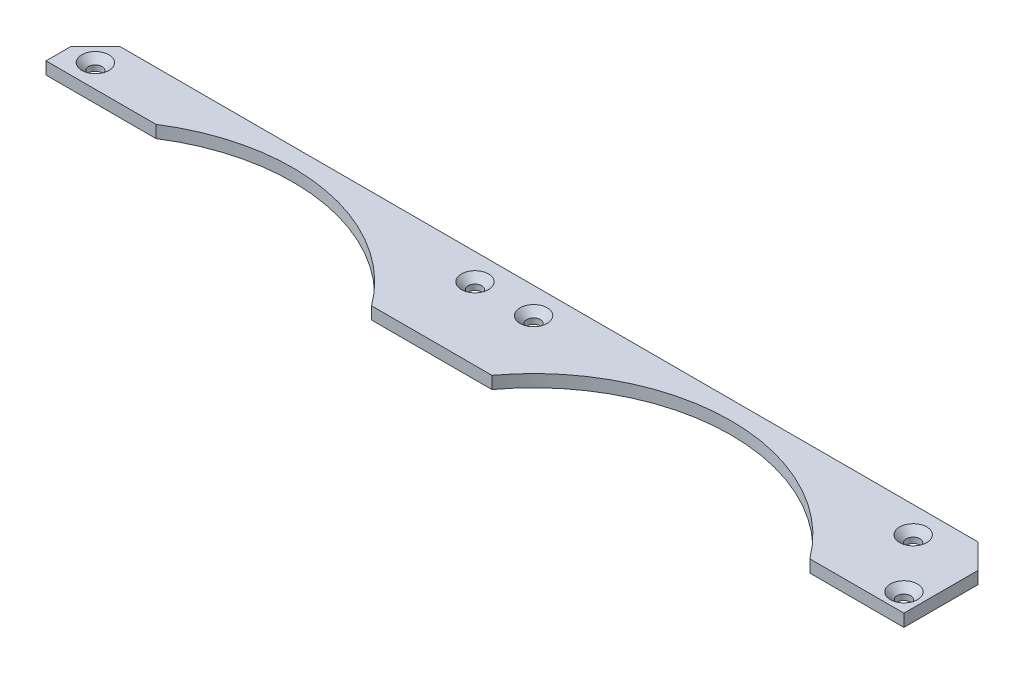
ISO-10303-21;
HEADER;
FILE_DESCRIPTION(('STEP AP214'),'2;1');
FILE_NAME('part.step','',(''),(''),'','','');
FILE_SCHEMA(('AUTOMOTIVE_DESIGN { 1 0 10303 214 1 1 1 1 }'));
ENDSEC;
DATA;
#1=APPLICATION_CONTEXT('core data for automotive mechanical design processes');
#2=APPLICATION_PROTOCOL_DEFINITION('international standard','automotive_design',2000,#1);
#3=PRODUCT_CONTEXT('',#1,'mechanical');
#4=PRODUCT('Part','Part','',(#3));
#5=PRODUCT_RELATED_PRODUCT_CATEGORY('part','',(#4));
#6=PRODUCT_DEFINITION_FORMATION('','',#4);
#7=PRODUCT_DEFINITION_CONTEXT('part definition',#1,'design');
#8=PRODUCT_DEFINITION('design','',#6,#7);
#9=PRODUCT_DEFINITION_SHAPE('','',#8);
#10=(LENGTH_UNIT() NAMED_UNIT(*) SI_UNIT(.MILLI.,.METRE.));
#11=(NAMED_UNIT(*) PLANE_ANGLE_UNIT() SI_UNIT($,.RADIAN.));
#12=(NAMED_UNIT(*) SI_UNIT($,.STERADIAN.) SOLID_ANGLE_UNIT());
#13=UNCERTAINTY_MEASURE_WITH_UNIT(LENGTH_MEASURE(1.E-05),#10,'distance_accuracy_value','');
#14=(GEOMETRIC_REPRESENTATION_CONTEXT(3) GLOBAL_UNCERTAINTY_ASSIGNED_CONTEXT((#13)) GLOBAL_UNIT_ASSIGNED_CONTEXT((#10,
#11,#12)) REPRESENTATION_CONTEXT('',''));
#15=CARTESIAN_POINT('',(0.,0.,0.));
#16=DIRECTION('',(0.,0.,1.));
#17=DIRECTION('',(1.,0.,0.));
#18=AXIS2_PLACEMENT_3D('',#15,#16,#17);
#19=CARTESIAN_POINT('',(0.,2.,37.));
#20=DIRECTION('',(1.,0.,0.));
#21=DIRECTION('',(0.,0.,-1.));
#22=AXIS2_PLACEMENT_3D('',#19,#20,#21);
#23=PLANE('',#22);
#24=DIRECTION('',(0.,0.,1.));
#25=VECTOR('',#24,1.);
#26=CARTESIAN_POINT('',(0.,0.,37.));
#27=LINE('',#26,#25);
#28=CARTESIAN_POINT('',(0.,0.,4.));
#29=VERTEX_POINT('',#28);
#30=CARTESIAN_POINT('',(0.,0.,8.));
#31=VERTEX_POINT('',#30);
#32=EDGE_CURVE('E177',#29,#31,#27,.T.);
#33=ORIENTED_EDGE('',*,*,#32,.T.);
#34=DIRECTION('',(0.,1.,0.));
#35=VECTOR('',#34,1.);
#36=CARTESIAN_POINT('',(0.,2.,8.));
#37=LINE('',#36,#35);
#38=CARTESIAN_POINT('',(0.,2.,8.));
#39=VERTEX_POINT('',#38);
#40=EDGE_CURVE('E183',#31,#39,#37,.T.);
#41=ORIENTED_EDGE('',*,*,#40,.T.);
#42=DIRECTION('',(0.,0.,1.));
#43=VECTOR('',#42,1.);
#44=CARTESIAN_POINT('',(0.,2.,37.));
#45=LINE('',#44,#43);
#46=CARTESIAN_POINT('',(0.,2.,4.));
#47=VERTEX_POINT('',#46);
#48=EDGE_CURVE('E187',#47,#39,#45,.T.);
#49=ORIENTED_EDGE('',*,*,#48,.F.);
#50=DIRECTION('',(0.,-1.,0.));
#51=VECTOR('',#50,1.);
#52=CARTESIAN_POINT('',(0.,2.,4.));
#53=LINE('',#52,#51);
#54=EDGE_CURVE('E139',#47,#29,#53,.T.);
#55=ORIENTED_EDGE('',*,*,#54,.T.);
#56=EDGE_LOOP('',(#33,#41,#49,#55));
#57=FACE_BOUND('',#56,.T.);
#58=ADVANCED_FACE('F37',(#57),#23,.F.);
#59=CARTESIAN_POINT('',(147.,2.,37.));
#60=DIRECTION('',(-1.,0.,0.));
#61=DIRECTION('',(0.,0.,1.));
#62=AXIS2_PLACEMENT_3D('',#59,#60,#61);
#63=PLANE('',#62);
#64=DIRECTION('',(0.,0.,-1.));
#65=VECTOR('',#64,1.);
#66=CARTESIAN_POINT('',(147.,2.,37.));
#67=LINE('',#66,#65);
#68=CARTESIAN_POINT('',(147.,2.,16.));
#69=VERTEX_POINT('',#68);
#70=CARTESIAN_POINT('',(147.,2.,4.00000000000003));
#71=VERTEX_POINT('',#70);
#72=EDGE_CURVE('E142',#69,#71,#67,.T.);
#73=ORIENTED_EDGE('',*,*,#72,.F.);
#74=DIRECTION('',(0.,-1.,0.));
#75=VECTOR('',#74,1.);
#76=CARTESIAN_POINT('',(147.,2.,16.));
#77=LINE('',#76,#75);
#78=CARTESIAN_POINT('',(147.,0.,16.));
#79=VERTEX_POINT('',#78);
#80=EDGE_CURVE('E209',#69,#79,#77,.T.);
#81=ORIENTED_EDGE('',*,*,#80,.T.);
#82=DIRECTION('',(0.,0.,-1.));
#83=VECTOR('',#82,1.);
#84=CARTESIAN_POINT('',(147.,0.,37.));
#85=LINE('',#84,#83);
#86=CARTESIAN_POINT('',(147.,0.,4.00000000000003));
#87=VERTEX_POINT('',#86);
#88=EDGE_CURVE('E181',#79,#87,#85,.T.);
#89=ORIENTED_EDGE('',*,*,#88,.T.);
#90=DIRECTION('',(0.,1.,0.));
#91=VECTOR('',#90,1.);
#92=CARTESIAN_POINT('',(147.,2.,4.00000000000003));
#93=LINE('',#92,#91);
#94=EDGE_CURVE('E164',#87,#71,#93,.T.);
#95=ORIENTED_EDGE('',*,*,#94,.T.);
#96=EDGE_LOOP('',(#73,#81,#89,#95));
#97=FACE_BOUND('',#96,.T.);
#98=ADVANCED_FACE('F293',(#97),#63,.F.);
#99=CARTESIAN_POINT('',(0.,2.,0.));
#100=DIRECTION('',(0.,0.,1.));
#101=DIRECTION('',(1.,0.,0.));
#102=AXIS2_PLACEMENT_3D('',#99,#100,#101);
#103=PLANE('',#102);
#104=DIRECTION('',(-1.,0.,0.));
#105=VECTOR('',#104,1.);
#106=CARTESIAN_POINT('',(0.,0.,0.));
#107=LINE('',#106,#105);
#108=CARTESIAN_POINT('',(143.,0.,0.));
#109=VERTEX_POINT('',#108);
#110=CARTESIAN_POINT('',(4.,0.,0.));
#111=VERTEX_POINT('',#110);
#112=EDGE_CURVE('E145',#109,#111,#107,.T.);
#113=ORIENTED_EDGE('',*,*,#112,.T.);
#114=DIRECTION('',(0.,1.,0.));
#115=VECTOR('',#114,1.);
#116=CARTESIAN_POINT('',(4.,2.,0.));
#117=LINE('',#116,#115);
#118=CARTESIAN_POINT('',(4.,2.,0.));
#119=VERTEX_POINT('',#118);
#120=EDGE_CURVE('E158',#111,#119,#117,.T.);
#121=ORIENTED_EDGE('',*,*,#120,.T.);
#122=DIRECTION('',(-1.,0.,0.));
#123=VECTOR('',#122,1.);
#124=CARTESIAN_POINT('',(0.,2.,0.));
#125=LINE('',#124,#123);
#126=CARTESIAN_POINT('',(143.,2.,0.));
#127=VERTEX_POINT('',#126);
#128=EDGE_CURVE('E137',#127,#119,#125,.T.);
#129=ORIENTED_EDGE('',*,*,#128,.F.);
#130=DIRECTION('',(0.,-1.,0.));
#131=VECTOR('',#130,1.);
#132=CARTESIAN_POINT('',(143.,2.,0.));
#133=LINE('',#132,#131);
#134=EDGE_CURVE('E155',#127,#109,#133,.T.);
#135=ORIENTED_EDGE('',*,*,#134,.T.);
#136=EDGE_LOOP('',(#113,#121,#129,#135));
#137=FACE_BOUND('',#136,.T.);
#138=ADVANCED_FACE('F196',(#137),#103,.F.);
#139=CARTESIAN_POINT('',(0.,2.,0.));
#140=DIRECTION('',(0.,-1.,0.));
#141=DIRECTION('',(0.,0.,-1.));
#142=AXIS2_PLACEMENT_3D('',#139,#140,#141);
#143=PLANE('',#142);
#144=CARTESIAN_POINT('',(4.24999999999994,2.,4.25));
#145=DIRECTION('',(0.,1.,0.));
#146=DIRECTION('',(0.,0.,1.));
#147=AXIS2_PLACEMENT_3D('',#144,#145,#146);
#148=CIRCLE('',#147,2.2);
#149=CARTESIAN_POINT('',(4.24999999999994,2.,6.45));
#150=VERTEX_POINT('',#149);
#151=EDGE_CURVE('E258',#150,#150,#148,.T.);
#152=ORIENTED_EDGE('',*,*,#151,.F.);
#153=EDGE_LOOP('',(#152));
#154=FACE_BOUND('',#153,.T.);
#155=CARTESIAN_POINT('',(65.7499999999999,2.,4.25));
#156=DIRECTION('',(0.,1.,0.));
#157=DIRECTION('',(0.,0.,1.));
#158=AXIS2_PLACEMENT_3D('',#155,#156,#157);
#159=CIRCLE('',#158,2.20000000000001);
#160=CARTESIAN_POINT('',(65.7499999999999,2.,6.45000000000001));
#161=VERTEX_POINT('',#160);
#162=EDGE_CURVE('E249',#161,#161,#159,.T.);
#163=ORIENTED_EDGE('',*,*,#162,.F.);
#164=EDGE_LOOP('',(#163));
#165=FACE_BOUND('',#164,.T.);
#166=CARTESIAN_POINT('',(75.25,2.,4.25000000000001));
#167=DIRECTION('',(0.,1.,0.));
#168=DIRECTION('',(0.,0.,1.));
#169=AXIS2_PLACEMENT_3D('',#166,#167,#168);
#170=CIRCLE('',#169,2.20000000000001);
#171=CARTESIAN_POINT('',(75.25,2.,6.45000000000002));
#172=VERTEX_POINT('',#171);
#173=EDGE_CURVE('E240',#172,#172,#170,.T.);
#174=ORIENTED_EDGE('',*,*,#173,.F.);
#175=EDGE_LOOP('',(#174));
#176=FACE_BOUND('',#175,.T.);
#177=CARTESIAN_POINT('',(136.75,2.,4.25000000000001));
#178=DIRECTION('',(0.,1.,0.));
#179=DIRECTION('',(0.,0.,1.));
#180=AXIS2_PLACEMENT_3D('',#177,#178,#179);
#181=CIRCLE('',#180,2.20000000000001);
#182=CARTESIAN_POINT('',(136.75,2.,6.45000000000002));
#183=VERTEX_POINT('',#182);
#184=EDGE_CURVE('E231',#183,#183,#181,.T.);
#185=ORIENTED_EDGE('',*,*,#184,.F.);
#186=EDGE_LOOP('',(#185));
#187=FACE_BOUND('',#186,.T.);
#188=CARTESIAN_POINT('',(144.,2.,13.));
#189=DIRECTION('',(0.,1.,0.));
#190=DIRECTION('',(0.,0.,1.));
#191=AXIS2_PLACEMENT_3D('',#188,#189,#190);
#192=CIRCLE('',#191,2.20000000000001);
#193=CARTESIAN_POINT('',(144.,2.,15.2));
#194=VERTEX_POINT('',#193);
#195=EDGE_CURVE('E222',#194,#194,#192,.T.);
#196=ORIENTED_EDGE('',*,*,#195,.F.);
#197=EDGE_LOOP('',(#196));
#198=FACE_BOUND('',#197,.T.);
#199=ORIENTED_EDGE('',*,*,#48,.T.);
#200=DIRECTION('',(1.,0.,0.));
#201=VECTOR('',#200,1.);
#202=CARTESIAN_POINT('',(0.,2.,8.));
#203=LINE('',#202,#201);
#204=CARTESIAN_POINT('',(17.8244359626822,2.,8.00000000000001));
#205=VERTEX_POINT('',#204);
#206=EDGE_CURVE('E208',#39,#205,#203,.T.);
#207=ORIENTED_EDGE('',*,*,#206,.T.);
#208=CARTESIAN_POINT('',(34.9999999999999,2.,35.));
#209=DIRECTION('',(0.,1.,0.));
#210=DIRECTION('',(0.,0.,1.));
#211=AXIS2_PLACEMENT_3D('',#208,#209,#210);
#212=CIRCLE('',#211,32.);
#213=CARTESIAN_POINT('',(60.7487863791674,2.,16.));
#214=VERTEX_POINT('',#213);
#215=EDGE_CURVE('E178',#214,#205,#212,.T.);
#216=ORIENTED_EDGE('',*,*,#215,.F.);
#217=DIRECTION('',(1.,0.,0.));
#218=VECTOR('',#217,1.);
#219=CARTESIAN_POINT('',(0.,2.,16.));
#220=LINE('',#219,#218);
#221=CARTESIAN_POINT('',(80.2512136208326,2.,16.));
#222=VERTEX_POINT('',#221);
#223=EDGE_CURVE('E119',#214,#222,#220,.T.);
#224=ORIENTED_EDGE('',*,*,#223,.T.);
#225=CARTESIAN_POINT('',(106.,2.,35.));
#226=DIRECTION('',(0.,1.,0.));
#227=DIRECTION('',(0.,0.,1.));
#228=AXIS2_PLACEMENT_3D('',#225,#226,#227);
#229=CIRCLE('',#228,32.);
#230=CARTESIAN_POINT('',(131.748786379167,2.,16.));
#231=VERTEX_POINT('',#230);
#232=EDGE_CURVE('E172',#231,#222,#229,.T.);
#233=ORIENTED_EDGE('',*,*,#232,.F.);
#234=DIRECTION('',(1.,0.,0.));
#235=VECTOR('',#234,1.);
#236=CARTESIAN_POINT('',(0.,2.,16.));
#237=LINE('',#236,#235);
#238=EDGE_CURVE('E60',#231,#69,#237,.T.);
#239=ORIENTED_EDGE('',*,*,#238,.T.);
#240=ORIENTED_EDGE('',*,*,#72,.T.);
#241=DIRECTION('',(0.707106781186545,0.,0.70710678118655));
#242=VECTOR('',#241,1.);
#243=CARTESIAN_POINT('',(143.,2.,0.));
#244=LINE('',#243,#242);
#245=EDGE_CURVE('E160',#71,#127,#244,.F.);
#246=ORIENTED_EDGE('',*,*,#245,.T.);
#247=ORIENTED_EDGE('',*,*,#128,.T.);
#248=DIRECTION('',(0.707106781186548,0.,-0.707106781186548));
#249=VECTOR('',#248,1.);
#250=CARTESIAN_POINT('',(0.,2.,4.));
#251=LINE('',#250,#249);
#252=EDGE_CURVE('E162',#119,#47,#251,.F.);
#253=ORIENTED_EDGE('',*,*,#252,.T.);
#254=EDGE_LOOP('',(#199,#207,#216,#224,#233,#239,#240,#246,#247,#253));
#255=FACE_BOUND('',#254,.T.);
#256=ADVANCED_FACE('F175',(#154,#165,#176,#187,#198,#255),#143,.F.);
#257=CARTESIAN_POINT('',(0.,0.,0.));
#258=DIRECTION('',(0.,-1.,0.));
#259=DIRECTION('',(0.,0.,-1.));
#260=AXIS2_PLACEMENT_3D('',#257,#258,#259);
#261=PLANE('',#260);
#262=CARTESIAN_POINT('',(4.24999999999994,0.,4.25));
#263=DIRECTION('',(0.,1.,0.));
#264=DIRECTION('',(0.,0.,1.));
#265=AXIS2_PLACEMENT_3D('',#262,#263,#264);
#266=CIRCLE('',#265,1.09999999999999);
#267=CARTESIAN_POINT('',(4.24999999999994,0.,5.34999999999999));
#268=VERTEX_POINT('',#267);
#269=EDGE_CURVE('E252',#268,#268,#266,.T.);
#270=ORIENTED_EDGE('',*,*,#269,.T.);
#271=EDGE_LOOP('',(#270));
#272=FACE_BOUND('',#271,.T.);
#273=CARTESIAN_POINT('',(65.7499999999999,0.,4.25));
#274=DIRECTION('',(0.,1.,0.));
#275=DIRECTION('',(0.,0.,1.));
#276=AXIS2_PLACEMENT_3D('',#273,#274,#275);
#277=CIRCLE('',#276,1.09999999999999);
#278=CARTESIAN_POINT('',(65.7499999999999,0.,5.34999999999999));
#279=VERTEX_POINT('',#278);
#280=EDGE_CURVE('E243',#279,#279,#277,.T.);
#281=ORIENTED_EDGE('',*,*,#280,.T.);
#282=EDGE_LOOP('',(#281));
#283=FACE_BOUND('',#282,.T.);
#284=CARTESIAN_POINT('',(75.25,0.,4.25000000000001));
#285=DIRECTION('',(0.,1.,0.));
#286=DIRECTION('',(0.,0.,1.));
#287=AXIS2_PLACEMENT_3D('',#284,#285,#286);
#288=CIRCLE('',#287,1.09999999999999);
#289=CARTESIAN_POINT('',(75.25,0.,5.35));
#290=VERTEX_POINT('',#289);
#291=EDGE_CURVE('E234',#290,#290,#288,.T.);
#292=ORIENTED_EDGE('',*,*,#291,.T.);
#293=EDGE_LOOP('',(#292));
#294=FACE_BOUND('',#293,.T.);
#295=CARTESIAN_POINT('',(136.75,0.,4.25000000000001));
#296=DIRECTION('',(0.,1.,0.));
#297=DIRECTION('',(0.,0.,1.));
#298=AXIS2_PLACEMENT_3D('',#295,#296,#297);
#299=CIRCLE('',#298,1.09999999999999);
#300=CARTESIAN_POINT('',(136.75,0.,5.35));
#301=VERTEX_POINT('',#300);
#302=EDGE_CURVE('E225',#301,#301,#299,.T.);
#303=ORIENTED_EDGE('',*,*,#302,.T.);
#304=EDGE_LOOP('',(#303));
#305=FACE_BOUND('',#304,.T.);
#306=CARTESIAN_POINT('',(144.,0.,13.));
#307=DIRECTION('',(0.,1.,0.));
#308=DIRECTION('',(0.,0.,1.));
#309=AXIS2_PLACEMENT_3D('',#306,#307,#308);
#310=CIRCLE('',#309,1.09999999999999);
#311=CARTESIAN_POINT('',(144.,0.,14.1));
#312=VERTEX_POINT('',#311);
#313=EDGE_CURVE('E134',#312,#312,#310,.T.);
#314=ORIENTED_EDGE('',*,*,#313,.T.);
#315=EDGE_LOOP('',(#314));
#316=FACE_BOUND('',#315,.T.);
#317=DIRECTION('',(1.,0.,0.));
#318=VECTOR('',#317,1.);
#319=CARTESIAN_POINT('',(-13.1181404683858,0.,8.));
#320=LINE('',#319,#318);
#321=CARTESIAN_POINT('',(17.8244359626822,0.,8.00000000000001));
#322=VERTEX_POINT('',#321);
#323=EDGE_CURVE('E53',#31,#322,#320,.T.);
#324=ORIENTED_EDGE('',*,*,#323,.F.);
#325=ORIENTED_EDGE('',*,*,#32,.F.);
#326=DIRECTION('',(-0.707106781186548,0.,0.707106781186548));
#327=VECTOR('',#326,1.);
#328=CARTESIAN_POINT('',(2.,0.,2.));
#329=LINE('',#328,#327);
#330=EDGE_CURVE('E153',#29,#111,#329,.F.);
#331=ORIENTED_EDGE('',*,*,#330,.T.);
#332=ORIENTED_EDGE('',*,*,#112,.F.);
#333=DIRECTION('',(-0.707106781186545,0.,-0.70710678118655));
#334=VECTOR('',#333,1.);
#335=CARTESIAN_POINT('',(71.5000000000005,0.,-71.5));
#336=LINE('',#335,#334);
#337=EDGE_CURVE('E150',#109,#87,#336,.F.);
#338=ORIENTED_EDGE('',*,*,#337,.T.);
#339=ORIENTED_EDGE('',*,*,#88,.F.);
#340=DIRECTION('',(1.,0.,0.));
#341=VECTOR('',#340,1.);
#342=CARTESIAN_POINT('',(104.033244948155,0.,16.));
#343=LINE('',#342,#341);
#344=CARTESIAN_POINT('',(131.748786379167,0.,16.));
#345=VERTEX_POINT('',#344);
#346=EDGE_CURVE('E133',#345,#79,#343,.T.);
#347=ORIENTED_EDGE('',*,*,#346,.F.);
#348=CARTESIAN_POINT('',(106.,0.,35.));
#349=DIRECTION('',(0.,-1.,0.));
#350=DIRECTION('',(0.,0.,-1.));
#351=AXIS2_PLACEMENT_3D('',#348,#349,#350);
#352=CIRCLE('',#351,32.);
#353=CARTESIAN_POINT('',(80.2512136208326,0.,16.));
#354=VERTEX_POINT('',#353);
#355=EDGE_CURVE('E132',#354,#345,#352,.T.);
#356=ORIENTED_EDGE('',*,*,#355,.F.);
#357=DIRECTION('',(1.,0.,0.));
#358=VECTOR('',#357,1.);
#359=CARTESIAN_POINT('',(60.1201107922798,0.,16.));
#360=LINE('',#359,#358);
#361=CARTESIAN_POINT('',(60.7487863791674,0.,16.));
#362=VERTEX_POINT('',#361);
#363=EDGE_CURVE('E116',#362,#354,#360,.T.);
#364=ORIENTED_EDGE('',*,*,#363,.F.);
#365=CARTESIAN_POINT('',(34.9999999999999,0.,35.));
#366=DIRECTION('',(0.,-1.,0.));
#367=DIRECTION('',(0.,0.,-1.));
#368=AXIS2_PLACEMENT_3D('',#365,#366,#367);
#369=CIRCLE('',#368,32.);
#370=EDGE_CURVE('E129',#322,#362,#369,.T.);
#371=ORIENTED_EDGE('',*,*,#370,.F.);
#372=EDGE_LOOP('',(#324,#325,#331,#332,#338,#339,#347,#356,#364,#371));
#373=FACE_BOUND('',#372,.T.);
#374=ADVANCED_FACE('F128',(#272,#283,#294,#305,#316,#373),#261,.T.);
#375=CARTESIAN_POINT('',(34.9999999999999,-8.,35.));
#376=DIRECTION('',(0.,1.,0.));
#377=DIRECTION('',(0.,0.,1.));
#378=AXIS2_PLACEMENT_3D('',#375,#376,#377);
#379=CYLINDRICAL_SURFACE('',#378,32.);
#380=ORIENTED_EDGE('',*,*,#215,.T.);
#381=DIRECTION('',(0.,1.,0.));
#382=VECTOR('',#381,1.);
#383=CARTESIAN_POINT('',(17.8244359626822,-8.,8.00000000000001));
#384=LINE('',#383,#382);
#385=EDGE_CURVE('E11',#205,#322,#384,.F.);
#386=ORIENTED_EDGE('',*,*,#385,.T.);
#387=ORIENTED_EDGE('',*,*,#370,.T.);
#388=DIRECTION('',(0.,1.,0.));
#389=VECTOR('',#388,1.);
#390=CARTESIAN_POINT('',(60.7487863791674,-8.,16.));
#391=LINE('',#390,#389);
#392=EDGE_CURVE('E113',#362,#214,#391,.T.);
#393=ORIENTED_EDGE('',*,*,#392,.T.);
#394=EDGE_LOOP('',(#380,#386,#387,#393));
#395=FACE_BOUND('',#394,.T.);
#396=ADVANCED_FACE('F136',(#395),#379,.F.);
#397=CARTESIAN_POINT('',(106.,-8.,35.));
#398=DIRECTION('',(0.,1.,0.));
#399=DIRECTION('',(0.,0.,1.));
#400=AXIS2_PLACEMENT_3D('',#397,#398,#399);
#401=CYLINDRICAL_SURFACE('',#400,32.);
#402=ORIENTED_EDGE('',*,*,#355,.T.);
#403=DIRECTION('',(0.,1.,0.));
#404=VECTOR('',#403,1.);
#405=CARTESIAN_POINT('',(131.748786379167,-8.,16.));
#406=LINE('',#405,#404);
#407=EDGE_CURVE('E46',#345,#231,#406,.T.);
#408=ORIENTED_EDGE('',*,*,#407,.T.);
#409=ORIENTED_EDGE('',*,*,#232,.T.);
#410=DIRECTION('',(0.,1.,0.));
#411=VECTOR('',#410,1.);
#412=CARTESIAN_POINT('',(80.2512136208326,-8.,16.));
#413=LINE('',#412,#411);
#414=EDGE_CURVE('E167',#222,#354,#413,.F.);
#415=ORIENTED_EDGE('',*,*,#414,.T.);
#416=EDGE_LOOP('',(#402,#408,#409,#415));
#417=FACE_BOUND('',#416,.T.);
#418=ADVANCED_FACE('F171',(#417),#401,.F.);
#419=CARTESIAN_POINT('',(0.,2.,4.));
#420=DIRECTION('',(0.707106781186547,0.,0.707106781186547));
#421=DIRECTION('',(0.,-1.,0.));
#422=AXIS2_PLACEMENT_3D('',#419,#420,#421);
#423=PLANE('',#422);
#424=ORIENTED_EDGE('',*,*,#252,.F.);
#425=ORIENTED_EDGE('',*,*,#120,.F.);
#426=ORIENTED_EDGE('',*,*,#330,.F.);
#427=ORIENTED_EDGE('',*,*,#54,.F.);
#428=EDGE_LOOP('',(#424,#425,#426,#427));
#429=FACE_BOUND('',#428,.T.);
#430=ADVANCED_FACE('F201',(#429),#423,.F.);
#431=CARTESIAN_POINT('',(143.,2.,0.));
#432=DIRECTION('',(-0.70710678118655,0.,0.707106781186545));
#433=DIRECTION('',(0.,-1.,0.));
#434=AXIS2_PLACEMENT_3D('',#431,#432,#433);
#435=PLANE('',#434);
#436=ORIENTED_EDGE('',*,*,#245,.F.);
#437=ORIENTED_EDGE('',*,*,#94,.F.);
#438=ORIENTED_EDGE('',*,*,#337,.F.);
#439=ORIENTED_EDGE('',*,*,#134,.F.);
#440=EDGE_LOOP('',(#436,#437,#438,#439));
#441=FACE_BOUND('',#440,.T.);
#442=ADVANCED_FACE('F40',(#441),#435,.F.);
#443=CARTESIAN_POINT('',(60.1201107922798,10.,16.));
#444=DIRECTION('',(0.,0.,-1.));
#445=DIRECTION('',(-1.,0.,0.));
#446=AXIS2_PLACEMENT_3D('',#443,#444,#445);
#447=PLANE('',#446);
#448=ORIENTED_EDGE('',*,*,#363,.T.);
#449=ORIENTED_EDGE('',*,*,#414,.F.);
#450=ORIENTED_EDGE('',*,*,#223,.F.);
#451=ORIENTED_EDGE('',*,*,#392,.F.);
#452=EDGE_LOOP('',(#448,#449,#450,#451));
#453=FACE_BOUND('',#452,.T.);
#454=ADVANCED_FACE('F115',(#453),#447,.F.);
#455=CARTESIAN_POINT('',(104.033244948155,10.,16.));
#456=DIRECTION('',(0.,0.,-1.));
#457=DIRECTION('',(-1.,0.,0.));
#458=AXIS2_PLACEMENT_3D('',#455,#456,#457);
#459=PLANE('',#458);
#460=ORIENTED_EDGE('',*,*,#238,.F.);
#461=ORIENTED_EDGE('',*,*,#407,.F.);
#462=ORIENTED_EDGE('',*,*,#346,.T.);
#463=ORIENTED_EDGE('',*,*,#80,.F.);
#464=EDGE_LOOP('',(#460,#461,#462,#463));
#465=FACE_BOUND('',#464,.T.);
#466=ADVANCED_FACE('F353',(#465),#459,.F.);
#467=CARTESIAN_POINT('',(-13.1181404683858,10.,8.));
#468=DIRECTION('',(0.,0.,-1.));
#469=DIRECTION('',(-1.,0.,0.));
#470=AXIS2_PLACEMENT_3D('',#467,#468,#469);
#471=PLANE('',#470);
#472=ORIENTED_EDGE('',*,*,#323,.T.);
#473=ORIENTED_EDGE('',*,*,#385,.F.);
#474=ORIENTED_EDGE('',*,*,#206,.F.);
#475=ORIENTED_EDGE('',*,*,#40,.F.);
#476=EDGE_LOOP('',(#472,#473,#474,#475));
#477=FACE_BOUND('',#476,.T.);
#478=ADVANCED_FACE('F288',(#477),#471,.F.);
#479=CARTESIAN_POINT('',(144.,2.,13.));
#480=DIRECTION('',(0.,1.,0.));
#481=DIRECTION('',(0.,0.,1.));
#482=AXIS2_PLACEMENT_3D('',#479,#480,#481);
#483=CYLINDRICAL_SURFACE('',#482,1.09999999999999);
#484=ORIENTED_EDGE('',*,*,#313,.F.);
#485=EDGE_LOOP('',(#484));
#486=FACE_BOUND('',#485,.T.);
#487=CARTESIAN_POINT('',(144.,0.9,13.));
#488=DIRECTION('',(0.,1.,0.));
#489=DIRECTION('',(0.,0.,1.));
#490=AXIS2_PLACEMENT_3D('',#487,#488,#489);
#491=CIRCLE('',#490,1.09999999999999);
#492=CARTESIAN_POINT('',(144.,0.9,14.1));
#493=VERTEX_POINT('',#492);
#494=EDGE_CURVE('E219',#493,#493,#491,.T.);
#495=ORIENTED_EDGE('',*,*,#494,.T.);
#496=EDGE_LOOP('',(#495));
#497=FACE_BOUND('',#496,.T.);
#498=ADVANCED_FACE('F278',(#486,#497),#483,.F.);
#499=CARTESIAN_POINT('',(144.,2.,13.));
#500=DIRECTION('',(0.,1.,0.));
#501=DIRECTION('',(0.,0.,1.));
#502=AXIS2_PLACEMENT_3D('',#499,#500,#501);
#503=CONICAL_SURFACE('',#502,2.20000000000001,0.785398163397456);
#504=ORIENTED_EDGE('',*,*,#494,.F.);
#505=EDGE_LOOP('',(#504));
#506=FACE_BOUND('',#505,.T.);
#507=ORIENTED_EDGE('',*,*,#195,.T.);
#508=EDGE_LOOP('',(#507));
#509=FACE_BOUND('',#508,.T.);
#510=ADVANCED_FACE('F275',(#506,#509),#503,.F.);
#511=CARTESIAN_POINT('',(136.75,2.,4.25000000000001));
#512=DIRECTION('',(0.,1.,0.));
#513=DIRECTION('',(0.,0.,1.));
#514=AXIS2_PLACEMENT_3D('',#511,#512,#513);
#515=CYLINDRICAL_SURFACE('',#514,1.09999999999999);
#516=ORIENTED_EDGE('',*,*,#302,.F.);
#517=EDGE_LOOP('',(#516));
#518=FACE_BOUND('',#517,.T.);
#519=CARTESIAN_POINT('',(136.75,0.9,4.25000000000001));
#520=DIRECTION('',(0.,1.,0.));
#521=DIRECTION('',(0.,0.,1.));
#522=AXIS2_PLACEMENT_3D('',#519,#520,#521);
#523=CIRCLE('',#522,1.09999999999999);
#524=CARTESIAN_POINT('',(136.75,0.9,5.35));
#525=VERTEX_POINT('',#524);
#526=EDGE_CURVE('E228',#525,#525,#523,.T.);
#527=ORIENTED_EDGE('',*,*,#526,.T.);
#528=EDGE_LOOP('',(#527));
#529=FACE_BOUND('',#528,.T.);
#530=ADVANCED_FACE('F277',(#518,#529),#515,.F.);
#531=CARTESIAN_POINT('',(136.75,2.,4.25000000000001));
#532=DIRECTION('',(0.,1.,0.));
#533=DIRECTION('',(0.,0.,1.));
#534=AXIS2_PLACEMENT_3D('',#531,#532,#533);
#535=CONICAL_SURFACE('',#534,2.20000000000001,0.785398163397456);
#536=ORIENTED_EDGE('',*,*,#526,.F.);
#537=EDGE_LOOP('',(#536));
#538=FACE_BOUND('',#537,.T.);
#539=ORIENTED_EDGE('',*,*,#184,.T.);
#540=EDGE_LOOP('',(#539));
#541=FACE_BOUND('',#540,.T.);
#542=ADVANCED_FACE('F285',(#538,#541),#535,.F.);
#543=CARTESIAN_POINT('',(75.25,2.,4.25000000000001));
#544=DIRECTION('',(0.,1.,0.));
#545=DIRECTION('',(0.,0.,1.));
#546=AXIS2_PLACEMENT_3D('',#543,#544,#545);
#547=CYLINDRICAL_SURFACE('',#546,1.1);
#548=ORIENTED_EDGE('',*,*,#291,.F.);
#549=EDGE_LOOP('',(#548));
#550=FACE_BOUND('',#549,.T.);
#551=CARTESIAN_POINT('',(75.25,0.9,4.25000000000001));
#552=DIRECTION('',(0.,1.,0.));
#553=DIRECTION('',(0.,0.,1.));
#554=AXIS2_PLACEMENT_3D('',#551,#552,#553);
#555=CIRCLE('',#554,1.1);
#556=CARTESIAN_POINT('',(75.25,0.9,5.35000000000001));
#557=VERTEX_POINT('',#556);
#558=EDGE_CURVE('E237',#557,#557,#555,.T.);
#559=ORIENTED_EDGE('',*,*,#558,.T.);
#560=EDGE_LOOP('',(#559));
#561=FACE_BOUND('',#560,.T.);
#562=ADVANCED_FACE('F392',(#550,#561),#547,.F.);
#563=CARTESIAN_POINT('',(75.25,2.,4.25000000000001));
#564=DIRECTION('',(0.,1.,0.));
#565=DIRECTION('',(0.,0.,1.));
#566=AXIS2_PLACEMENT_3D('',#563,#564,#565);
#567=CONICAL_SURFACE('',#566,2.20000000000001,0.785398163397449);
#568=ORIENTED_EDGE('',*,*,#558,.F.);
#569=EDGE_LOOP('',(#568));
#570=FACE_BOUND('',#569,.T.);
#571=ORIENTED_EDGE('',*,*,#173,.T.);
#572=EDGE_LOOP('',(#571));
#573=FACE_BOUND('',#572,.T.);
#574=ADVANCED_FACE('F402',(#570,#573),#567,.F.);
#575=CARTESIAN_POINT('',(65.7499999999999,2.,4.25));
#576=DIRECTION('',(0.,1.,0.));
#577=DIRECTION('',(0.,0.,1.));
#578=AXIS2_PLACEMENT_3D('',#575,#576,#577);
#579=CYLINDRICAL_SURFACE('',#578,1.1);
#580=ORIENTED_EDGE('',*,*,#280,.F.);
#581=EDGE_LOOP('',(#580));
#582=FACE_BOUND('',#581,.T.);
#583=CARTESIAN_POINT('',(65.7499999999999,0.9,4.25));
#584=DIRECTION('',(0.,1.,0.));
#585=DIRECTION('',(0.,0.,1.));
#586=AXIS2_PLACEMENT_3D('',#583,#584,#585);
#587=CIRCLE('',#586,1.1);
#588=CARTESIAN_POINT('',(65.7499999999999,0.9,5.35000000000001));
#589=VERTEX_POINT('',#588);
#590=EDGE_CURVE('E246',#589,#589,#587,.T.);
#591=ORIENTED_EDGE('',*,*,#590,.T.);
#592=EDGE_LOOP('',(#591));
#593=FACE_BOUND('',#592,.T.);
#594=ADVANCED_FACE('F412',(#582,#593),#579,.F.);
#595=CARTESIAN_POINT('',(65.7499999999999,2.,4.25));
#596=DIRECTION('',(0.,1.,0.));
#597=DIRECTION('',(0.,0.,1.));
#598=AXIS2_PLACEMENT_3D('',#595,#596,#597);
#599=CONICAL_SURFACE('',#598,2.20000000000001,0.785398163397449);
#600=ORIENTED_EDGE('',*,*,#590,.F.);
#601=EDGE_LOOP('',(#600));
#602=FACE_BOUND('',#601,.T.);
#603=ORIENTED_EDGE('',*,*,#162,.T.);
#604=EDGE_LOOP('',(#603));
#605=FACE_BOUND('',#604,.T.);
#606=ADVANCED_FACE('F422',(#602,#605),#599,.F.);
#607=CARTESIAN_POINT('',(4.24999999999994,2.,4.25));
#608=DIRECTION('',(0.,1.,0.));
#609=DIRECTION('',(0.,0.,1.));
#610=AXIS2_PLACEMENT_3D('',#607,#608,#609);
#611=CYLINDRICAL_SURFACE('',#610,1.09999999999999);
#612=ORIENTED_EDGE('',*,*,#269,.F.);
#613=EDGE_LOOP('',(#612));
#614=FACE_BOUND('',#613,.T.);
#615=CARTESIAN_POINT('',(4.24999999999994,0.9,4.25));
#616=DIRECTION('',(0.,1.,0.));
#617=DIRECTION('',(0.,0.,1.));
#618=AXIS2_PLACEMENT_3D('',#615,#616,#617);
#619=CIRCLE('',#618,1.1);
#620=CARTESIAN_POINT('',(4.24999999999994,0.9,5.35));
#621=VERTEX_POINT('',#620);
#622=EDGE_CURVE('E255',#621,#621,#619,.T.);
#623=ORIENTED_EDGE('',*,*,#622,.T.);
#624=EDGE_LOOP('',(#623));
#625=FACE_BOUND('',#624,.T.);
#626=ADVANCED_FACE('F432',(#614,#625),#611,.F.);
#627=CARTESIAN_POINT('',(4.24999999999994,2.,4.25));
#628=DIRECTION('',(0.,1.,0.));
#629=DIRECTION('',(0.,0.,1.));
#630=AXIS2_PLACEMENT_3D('',#627,#628,#629);
#631=CONICAL_SURFACE('',#630,2.2,0.785398163397448);
#632=ORIENTED_EDGE('',*,*,#622,.F.);
#633=EDGE_LOOP('',(#632));
#634=FACE_BOUND('',#633,.T.);
#635=ORIENTED_EDGE('',*,*,#151,.T.);
#636=EDGE_LOOP('',(#635));
#637=FACE_BOUND('',#636,.T.);
#638=ADVANCED_FACE('F262',(#634,#637),#631,.F.);
#639=CLOSED_SHELL('',(#58,#98,#138,#256,#374,#396,#418,#430,#442,#454,#466,#478,#498,#510,#530,
#542,#562,#574,#594,#606,#626,#638));
#640=MANIFOLD_SOLID_BREP('B2',#639);
#641=ADVANCED_BREP_SHAPE_REPRESENTATION('',(#18,#640),#14);
#642=SHAPE_DEFINITION_REPRESENTATION(#9,#641);
ENDSEC;
END-ISO-10303-21;
